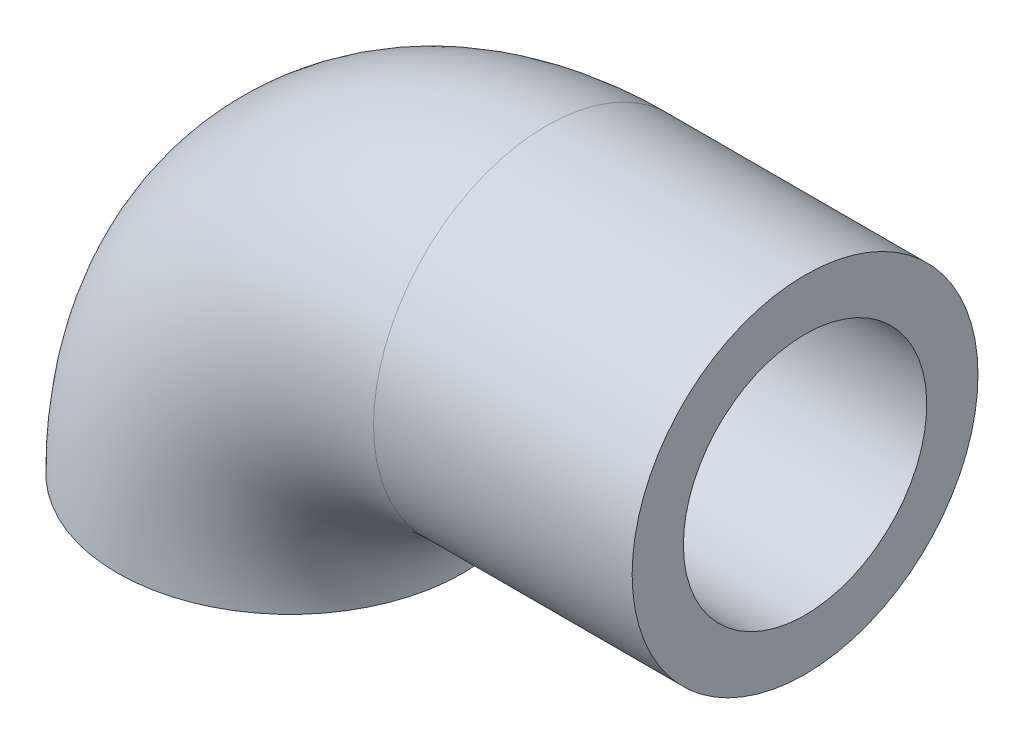
ISO-10303-21;
HEADER;
FILE_DESCRIPTION(('STEP AP214'),'2;1');
FILE_NAME('part.step','',(''),(''),'','','');
FILE_SCHEMA(('AUTOMOTIVE_DESIGN { 1 0 10303 214 1 1 1 1 }'));
ENDSEC;
DATA;
#1=APPLICATION_CONTEXT('core data for automotive mechanical design processes');
#2=APPLICATION_PROTOCOL_DEFINITION('international standard','automotive_design',2000,#1);
#3=PRODUCT_CONTEXT('',#1,'mechanical');
#4=PRODUCT('Part','Part','',(#3));
#5=PRODUCT_RELATED_PRODUCT_CATEGORY('part','',(#4));
#6=PRODUCT_DEFINITION_FORMATION('','',#4);
#7=PRODUCT_DEFINITION_CONTEXT('part definition',#1,'design');
#8=PRODUCT_DEFINITION('design','',#6,#7);
#9=PRODUCT_DEFINITION_SHAPE('','',#8);
#10=(LENGTH_UNIT() NAMED_UNIT(*) SI_UNIT(.MILLI.,.METRE.));
#11=(NAMED_UNIT(*) PLANE_ANGLE_UNIT() SI_UNIT($,.RADIAN.));
#12=(NAMED_UNIT(*) SI_UNIT($,.STERADIAN.) SOLID_ANGLE_UNIT());
#13=UNCERTAINTY_MEASURE_WITH_UNIT(LENGTH_MEASURE(1.E-05),#10,'distance_accuracy_value','');
#14=(GEOMETRIC_REPRESENTATION_CONTEXT(3) GLOBAL_UNCERTAINTY_ASSIGNED_CONTEXT((#13)) GLOBAL_UNIT_ASSIGNED_CONTEXT((#10,
#11,#12)) REPRESENTATION_CONTEXT('',''));
#15=CARTESIAN_POINT('',(0.,0.,0.));
#16=DIRECTION('',(0.,0.,1.));
#17=DIRECTION('',(1.,0.,0.));
#18=AXIS2_PLACEMENT_3D('',#15,#16,#17);
#19=CARTESIAN_POINT('',(10.,10.,0.));
#20=DIRECTION('',(1.,0.,0.));
#21=DIRECTION('',(0.,0.,-1.));
#22=AXIS2_PLACEMENT_3D('',#19,#20,#21);
#23=CYLINDRICAL_SURFACE('',#22,6.75);
#24=CARTESIAN_POINT('',(10.,10.,0.));
#25=DIRECTION('',(1.,0.,0.));
#26=DIRECTION('',(0.,0.,1.));
#27=AXIS2_PLACEMENT_3D('',#24,#25,#26);
#28=CIRCLE('',#27,6.75);
#29=CARTESIAN_POINT('',(10.,16.75,0.));
#30=VERTEX_POINT('',#29);
#31=EDGE_CURVE('E41',#30,#30,#28,.T.);
#32=ORIENTED_EDGE('',*,*,#31,.T.);
#33=EDGE_LOOP('',(#32));
#34=FACE_BOUND('',#33,.T.);
#35=CARTESIAN_POINT('',(20.094853237976,10.,0.));
#36=DIRECTION('',(1.,0.,0.));
#37=DIRECTION('',(0.,0.,1.));
#38=AXIS2_PLACEMENT_3D('',#35,#36,#37);
#39=CIRCLE('',#38,6.75);
#40=CARTESIAN_POINT('',(20.094853237976,10.,6.75));
#41=VERTEX_POINT('',#40);
#42=EDGE_CURVE('E10',#41,#41,#39,.T.);
#43=ORIENTED_EDGE('',*,*,#42,.F.);
#44=EDGE_LOOP('',(#43));
#45=FACE_BOUND('',#44,.T.);
#46=ADVANCED_FACE('F31',(#34,#45),#23,.T.);
#47=CARTESIAN_POINT('',(10.,10.,0.));
#48=DIRECTION('',(1.,0.,0.));
#49=DIRECTION('',(0.,0.,-1.));
#50=AXIS2_PLACEMENT_3D('',#47,#48,#49);
#51=CYLINDRICAL_SURFACE('',#50,4.75);
#52=CARTESIAN_POINT('',(10.,10.,0.));
#53=DIRECTION('',(1.,0.,0.));
#54=DIRECTION('',(0.,0.,1.));
#55=AXIS2_PLACEMENT_3D('',#52,#53,#54);
#56=CIRCLE('',#55,4.75);
#57=CARTESIAN_POINT('',(10.,14.75,0.));
#58=VERTEX_POINT('',#57);
#59=EDGE_CURVE('E45',#58,#58,#56,.T.);
#60=ORIENTED_EDGE('',*,*,#59,.F.);
#61=EDGE_LOOP('',(#60));
#62=FACE_BOUND('',#61,.T.);
#63=CARTESIAN_POINT('',(20.094853237976,10.,0.));
#64=DIRECTION('',(1.,0.,0.));
#65=DIRECTION('',(0.,0.,1.));
#66=AXIS2_PLACEMENT_3D('',#63,#64,#65);
#67=CIRCLE('',#66,4.75);
#68=CARTESIAN_POINT('',(20.094853237976,10.,4.75));
#69=VERTEX_POINT('',#68);
#70=EDGE_CURVE('E37',#69,#69,#67,.T.);
#71=ORIENTED_EDGE('',*,*,#70,.T.);
#72=EDGE_LOOP('',(#71));
#73=FACE_BOUND('',#72,.T.);
#74=ADVANCED_FACE('F63',(#62,#73),#51,.F.);
#75=CARTESIAN_POINT('',(10.,0.,0.));
#76=DIRECTION('',(0.,0.,1.));
#77=DIRECTION('',(1.,0.,0.));
#78=AXIS2_PLACEMENT_3D('',#75,#76,#77);
#79=TOROIDAL_SURFACE('',#78,10.,4.75);
#80=CARTESIAN_POINT('',(0.,0.,0.));
#81=DIRECTION('',(0.,1.,0.));
#82=DIRECTION('',(0.,0.,1.));
#83=AXIS2_PLACEMENT_3D('',#80,#81,#82);
#84=CIRCLE('',#83,4.75);
#85=CARTESIAN_POINT('',(-4.75,0.,0.));
#86=VERTEX_POINT('',#85);
#87=EDGE_CURVE('E53',#86,#86,#84,.T.);
#88=CARTESIAN_POINT('',(10.,0.,0.));
#89=DIRECTION('',(0.,0.,1.));
#90=DIRECTION('',(1.,0.,0.));
#91=AXIS2_PLACEMENT_3D('',#88,#89,#90);
#92=CIRCLE('',#91,14.75);
#93=EDGE_CURVE('',#58,#86,#92,.T.);
#94=ORIENTED_EDGE('',*,*,#59,.T.);
#95=ORIENTED_EDGE('',*,*,#87,.F.);
#96=ORIENTED_EDGE('',*,*,#93,.T.);
#97=ORIENTED_EDGE('',*,*,#93,.F.);
#98=EDGE_LOOP('',(#94,#96,#95,#97));
#99=FACE_BOUND('',#98,.T.);
#100=ADVANCED_FACE('F60',(#99),#79,.F.);
#101=CARTESIAN_POINT('',(10.,0.,0.));
#102=DIRECTION('',(0.,0.,1.));
#103=DIRECTION('',(1.,0.,0.));
#104=AXIS2_PLACEMENT_3D('',#101,#102,#103);
#105=TOROIDAL_SURFACE('',#104,10.,6.75);
#106=CARTESIAN_POINT('',(0.,0.,0.));
#107=DIRECTION('',(0.,1.,0.));
#108=DIRECTION('',(0.,0.,1.));
#109=AXIS2_PLACEMENT_3D('',#106,#107,#108);
#110=CIRCLE('',#109,6.75);
#111=CARTESIAN_POINT('',(-6.75,0.,0.));
#112=VERTEX_POINT('',#111);
#113=EDGE_CURVE('E50',#112,#112,#110,.T.);
#114=CARTESIAN_POINT('',(10.,0.,0.));
#115=DIRECTION('',(0.,0.,1.));
#116=DIRECTION('',(1.,0.,0.));
#117=AXIS2_PLACEMENT_3D('',#114,#115,#116);
#118=CIRCLE('',#117,16.75);
#119=EDGE_CURVE('',#30,#112,#118,.T.);
#120=ORIENTED_EDGE('',*,*,#31,.F.);
#121=ORIENTED_EDGE('',*,*,#113,.T.);
#122=ORIENTED_EDGE('',*,*,#119,.T.);
#123=ORIENTED_EDGE('',*,*,#119,.F.);
#124=EDGE_LOOP('',(#120,#122,#121,#123));
#125=FACE_BOUND('',#124,.T.);
#126=ADVANCED_FACE('F62',(#125),#105,.T.);
#127=CARTESIAN_POINT('',(20.094853237976,10.,0.));
#128=DIRECTION('',(1.,0.,0.));
#129=DIRECTION('',(0.,0.,1.));
#130=AXIS2_PLACEMENT_3D('',#127,#128,#129);
#131=PLANE('',#130);
#132=ORIENTED_EDGE('',*,*,#70,.F.);
#133=EDGE_LOOP('',(#132));
#134=FACE_BOUND('',#133,.T.);
#135=ORIENTED_EDGE('',*,*,#42,.T.);
#136=EDGE_LOOP('',(#135));
#137=FACE_BOUND('',#136,.T.);
#138=ADVANCED_FACE('F70',(#134,#137),#131,.T.);
#139=CARTESIAN_POINT('',(0.,0.,0.));
#140=DIRECTION('',(0.,1.,0.));
#141=DIRECTION('',(0.,0.,1.));
#142=AXIS2_PLACEMENT_3D('',#139,#140,#141);
#143=PLANE('',#142);
#144=ORIENTED_EDGE('',*,*,#87,.T.);
#145=EDGE_LOOP('',(#144));
#146=FACE_BOUND('',#145,.T.);
#147=ORIENTED_EDGE('',*,*,#113,.F.);
#148=EDGE_LOOP('',(#147));
#149=FACE_BOUND('',#148,.T.);
#150=ADVANCED_FACE('F57',(#146,#149),#143,.F.);
#151=CLOSED_SHELL('',(#46,#74,#100,#126,#138,#150));
#152=MANIFOLD_SOLID_BREP('B2',#151);
#153=ADVANCED_BREP_SHAPE_REPRESENTATION('',(#18,#152),#14);
#154=SHAPE_DEFINITION_REPRESENTATION(#9,#153);
ENDSEC;
END-ISO-10303-21;
